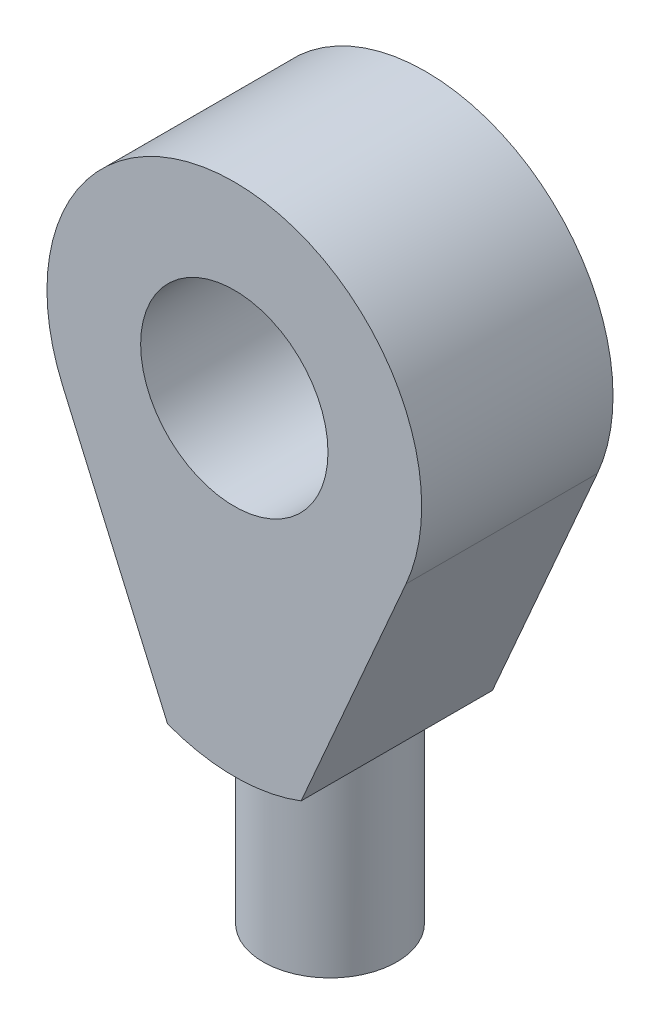
ISO-10303-21;
HEADER;
FILE_DESCRIPTION(('STEP AP214'),'2;1');
FILE_NAME('part.step','',(''),(''),'','','');
FILE_SCHEMA(('AUTOMOTIVE_DESIGN { 1 0 10303 214 1 1 1 1 }'));
ENDSEC;
DATA;
#1=APPLICATION_CONTEXT('core data for automotive mechanical design processes');
#2=APPLICATION_PROTOCOL_DEFINITION('international standard','automotive_design',2000,#1);
#3=PRODUCT_CONTEXT('',#1,'mechanical');
#4=PRODUCT('Part','Part','',(#3));
#5=PRODUCT_RELATED_PRODUCT_CATEGORY('part','',(#4));
#6=PRODUCT_DEFINITION_FORMATION('','',#4);
#7=PRODUCT_DEFINITION_CONTEXT('part definition',#1,'design');
#8=PRODUCT_DEFINITION('design','',#6,#7);
#9=PRODUCT_DEFINITION_SHAPE('','',#8);
#10=(LENGTH_UNIT() NAMED_UNIT(*) SI_UNIT(.MILLI.,.METRE.));
#11=(NAMED_UNIT(*) PLANE_ANGLE_UNIT() SI_UNIT($,.RADIAN.));
#12=(NAMED_UNIT(*) SI_UNIT($,.STERADIAN.) SOLID_ANGLE_UNIT());
#13=UNCERTAINTY_MEASURE_WITH_UNIT(LENGTH_MEASURE(1.E-05),#10,'distance_accuracy_value','');
#14=(GEOMETRIC_REPRESENTATION_CONTEXT(3) GLOBAL_UNCERTAINTY_ASSIGNED_CONTEXT((#13)) GLOBAL_UNIT_ASSIGNED_CONTEXT((#10,
#11,#12)) REPRESENTATION_CONTEXT('',''));
#15=CARTESIAN_POINT('',(0.,0.,0.));
#16=DIRECTION('',(0.,0.,1.));
#17=DIRECTION('',(1.,0.,0.));
#18=AXIS2_PLACEMENT_3D('',#15,#16,#17);
#19=CARTESIAN_POINT('',(0.,-3.74415824319179,2.5535));
#20=DIRECTION('',(0.,0.,-1.));
#21=DIRECTION('',(-1.,0.,0.));
#22=AXIS2_PLACEMENT_3D('',#19,#20,#21);
#23=CYLINDRICAL_SURFACE('',#22,5.);
#24=CARTESIAN_POINT('',(0.,-3.74415824319179,-2.5535));
#25=DIRECTION('',(0.,0.,1.));
#26=DIRECTION('',(1.,0.,0.));
#27=AXIS2_PLACEMENT_3D('',#24,#25,#26);
#28=CIRCLE('',#27,5.);
#29=CARTESIAN_POINT('',(-1.78257569495584,-8.41560597293818,-2.5535));
#30=VERTEX_POINT('',#29);
#31=CARTESIAN_POINT('',(1.78257569495584,-8.41560597293818,-2.5535));
#32=VERTEX_POINT('',#31);
#33=EDGE_CURVE('E122',#30,#32,#28,.T.);
#34=ORIENTED_EDGE('',*,*,#33,.T.);
#35=DIRECTION('',(0.,0.,-1.));
#36=VECTOR('',#35,1.);
#37=CARTESIAN_POINT('',(1.78257569495584,-8.41560597293818,2.5535));
#38=LINE('',#37,#36);
#39=CARTESIAN_POINT('',(1.78257569495584,-8.41560597293818,2.5535));
#40=VERTEX_POINT('',#39);
#41=EDGE_CURVE('E127',#40,#32,#38,.T.);
#42=ORIENTED_EDGE('',*,*,#41,.F.);
#43=CARTESIAN_POINT('',(0.,-3.74415824319179,2.5535));
#44=DIRECTION('',(0.,0.,1.));
#45=DIRECTION('',(1.,0.,0.));
#46=AXIS2_PLACEMENT_3D('',#43,#44,#45);
#47=CIRCLE('',#46,5.);
#48=CARTESIAN_POINT('',(-1.78257569495584,-8.41560597293818,2.5535));
#49=VERTEX_POINT('',#48);
#50=EDGE_CURVE('E113',#49,#40,#47,.T.);
#51=ORIENTED_EDGE('',*,*,#50,.F.);
#52=DIRECTION('',(0.,0.,-1.));
#53=VECTOR('',#52,1.);
#54=CARTESIAN_POINT('',(-1.78257569495584,-8.41560597293818,2.5535));
#55=LINE('',#54,#53);
#56=EDGE_CURVE('E130',#49,#30,#55,.T.);
#57=ORIENTED_EDGE('',*,*,#56,.T.);
#58=EDGE_LOOP('',(#34,#42,#51,#57));
#59=FACE_BOUND('',#58,.T.);
#60=CARTESIAN_POINT('',(-1.783,-8.41544404048572,0.));
#61=CARTESIAN_POINT('',(-1.78300204870079,-8.41544225055215,-0.0966687486173899));
#62=CARTESIAN_POINT('',(-1.77511201083355,-8.41847746815851,-0.193323323859854));
#63=CARTESIAN_POINT('',(-1.74388680267533,-8.43021547166098,-0.383741101134699));
#64=CARTESIAN_POINT('',(-1.72055083050801,-8.43891855180405,-0.477504152789002));
#65=CARTESIAN_POINT('',(-1.65938026698545,-8.46088378060267,-0.659343152631));
#66=CARTESIAN_POINT('',(-1.62157747900081,-8.47413592221476,-0.747431084003399));
#67=CARTESIAN_POINT('',(-1.53265736315804,-8.50369069688011,-0.916046767820779));
#68=CARTESIAN_POINT('',(-1.48153648026692,-8.51999414409842,-0.996572493847117));
#69=CARTESIAN_POINT('',(-1.3649747414681,-8.55463441080823,-1.15139044804879));
#70=CARTESIAN_POINT('',(-1.29903507005201,-8.57302702884546,-1.22529473390491));
#71=CARTESIAN_POINT('',(-1.15576870679623,-8.60930505557363,-1.36126561102769));
#72=CARTESIAN_POINT('',(-1.07843987800558,-8.62719036832604,-1.42332997573948));
#73=CARTESIAN_POINT('',(-0.911694731051714,-8.66109397488177,-1.53567812787832));
#74=CARTESIAN_POINT('',(-0.821982762232325,-8.67703912024034,-1.58554715400512));
#75=CARTESIAN_POINT('',(-0.634775199582545,-8.70460118849284,-1.66932799662043));
#76=CARTESIAN_POINT('',(-0.537282039658718,-8.71621945841272,-1.70324478016467));
#77=CARTESIAN_POINT('',(-0.341353195102965,-8.73342303574056,-1.75281838553072));
#78=CARTESIAN_POINT('',(-0.243105759314597,-8.73922786895913,-1.76914158096374));
#79=CARTESIAN_POINT('',(-0.0451061787319452,-8.74493444883303,-1.78519237670634));
#80=CARTESIAN_POINT('',(0.0546455146391507,-8.74483793255799,-1.78492486051237));
#81=CARTESIAN_POINT('',(0.248073012244122,-8.73889650426226,-1.76820569097229));
#82=CARTESIAN_POINT('',(0.341820796243922,-8.7333093431034,-1.75247970558897));
#83=CARTESIAN_POINT('',(0.525247089695727,-8.71734588891399,-1.70650125439661));
#84=CARTESIAN_POINT('',(0.614925314682114,-8.70696926166034,-1.6762477748101));
#85=CARTESIAN_POINT('',(0.789151533003908,-8.68228505454704,-1.60169762207798));
#86=CARTESIAN_POINT('',(0.87361008727431,-8.66792445664348,-1.55721020674817));
#87=CARTESIAN_POINT('',(1.03406423420748,-8.63674464615833,-1.45561814662698));
#88=CARTESIAN_POINT('',(1.11005724226286,-8.61992468631633,-1.39850966430311));
#89=CARTESIAN_POINT('',(1.25571973326146,-8.58451833881931,-1.26972583414325));
#90=CARTESIAN_POINT('',(1.32483519350775,-8.56588558632339,-1.19743567053106));
#91=CARTESIAN_POINT('',(1.450157692189,-8.52968932735765,-1.04215591838284));
#92=CARTESIAN_POINT('',(1.50636209737187,-8.51212603954452,-0.959164152599294));
#93=CARTESIAN_POINT('',(1.60518878066983,-8.47978200040321,-0.782849143368011));
#94=CARTESIAN_POINT('',(1.64754248432262,-8.46505831395548,-0.689364068317313));
#95=CARTESIAN_POINT('',(1.71570592982649,-8.44071855666418,-0.495927505957326));
#96=CARTESIAN_POINT('',(1.74152382669026,-8.4310999685258,-0.395979232940781));
#97=CARTESIAN_POINT('',(1.77468313324715,-8.41864211637545,-0.197882528329989));
#98=CARTESIAN_POINT('',(1.7828954209587,-8.41548368769826,-0.0999000156998455));
#99=CARTESIAN_POINT('',(1.7831025254825,-8.41540517704462,0.0960727421435664));
#100=CARTESIAN_POINT('',(1.77510086247396,-8.41848374096684,0.194062981060704));
#101=CARTESIAN_POINT('',(1.74389389853365,-8.43021080278229,0.383039725329369));
#102=CARTESIAN_POINT('',(1.72132989635962,-8.43862410672144,0.474148361737713));
#103=CARTESIAN_POINT('',(1.66242849501912,-8.459802854939,0.65125607686395));
#104=CARTESIAN_POINT('',(1.62608844113871,-8.4725691380105,0.737254167056843));
#105=CARTESIAN_POINT('',(1.53922795748122,-8.50156697538552,0.905042633000936));
#106=CARTESIAN_POINT('',(1.48825559142217,-8.51790420635593,0.986580268291881));
#107=CARTESIAN_POINT('',(1.37407212434439,-8.55201340113323,1.14025683204996));
#108=CARTESIAN_POINT('',(1.31085692786953,-8.5697858438822,1.21239260187003));
#109=CARTESIAN_POINT('',(1.16976279914558,-8.60597305868322,1.34942518154892));
#110=CARTESIAN_POINT('',(1.09125854619827,-8.62436763823166,1.41368553550655));
#111=CARTESIAN_POINT('',(0.924126786759345,-8.65875471454538,1.52818087204121));
#112=CARTESIAN_POINT('',(0.835499454810853,-8.67474725271589,1.5784160963895));
#113=CARTESIAN_POINT('',(0.650894808568895,-8.70248385721787,1.66303240966221));
#114=CARTESIAN_POINT('',(0.554957877391604,-8.71424946799413,1.69749414918203));
#115=CARTESIAN_POINT('',(0.358139690644887,-8.73229240491628,1.74962186855739));
#116=CARTESIAN_POINT('',(0.257260528810496,-8.73857203427941,1.76729489720533));
#117=CARTESIAN_POINT('',(0.0592037744732334,-8.7447371399863,1.78463914369696));
#118=CARTESIAN_POINT('',(-0.0378850271135194,-8.74494517695898,1.7852185022391));
#119=CARTESIAN_POINT('',(-0.230713503791566,-8.73976340006858,1.77065140956231));
#120=CARTESIAN_POINT('',(-0.326453315209246,-8.73437415602862,1.75550655912384));
#121=CARTESIAN_POINT('',(-0.511904668113668,-8.71873831846491,1.71054530369689));
#122=CARTESIAN_POINT('',(-0.601699204781967,-8.70859272741138,1.68103350659865));
#123=CARTESIAN_POINT('',(-0.775083158908863,-8.68449383843793,1.60846893675357));
#124=CARTESIAN_POINT('',(-0.858671410628845,-8.67053982746502,1.56541362801559));
#125=CARTESIAN_POINT('',(-1.02092284662026,-8.6395451495233,1.46501463671802));
#126=CARTESIAN_POINT('',(-1.09925548468536,-8.62240337628495,1.40716849235093));
#127=CARTESIAN_POINT('',(-1.24539055318258,-8.5871596846988,1.27964950689617));
#128=CARTESIAN_POINT('',(-1.31318937481222,-8.56905744013784,1.209972629727));
#129=CARTESIAN_POINT('',(-1.43956111373821,-8.53291466009824,1.05690644296318));
#130=CARTESIAN_POINT('',(-1.49755818711317,-8.51491616279492,0.973030051713991));
#131=CARTESIAN_POINT('',(-1.59862550917045,-8.48200939733302,0.796151261597241));
#132=CARTESIAN_POINT('',(-1.64169683697424,-8.4671009058004,0.703149523110305));
#133=CARTESIAN_POINT('',(-1.71152137108012,-8.44225202781046,0.510227460379807));
#134=CARTESIAN_POINT('',(-1.73822576887612,-8.43232651707402,0.410287422217113));
#135=CARTESIAN_POINT('',(-1.77395958900116,-8.4189250859456,0.20689166291151));
#136=CARTESIAN_POINT('',(-1.78299780784445,-8.41544595575456,0.103437717568953));
#137=CARTESIAN_POINT('',(-1.783,-8.41544404048572,0.));
#138=B_SPLINE_CURVE_WITH_KNOTS('',3,(#60,#61,#62,#63,#64,#65,#66,#67,#68,#69,#70,#71,#72,#73,
#74,#75,#76,#77,#78,#79,#80,#81,#82,#83,#84,#85,#86,#87,#88,#89,#90,#91,#92,#93,#94,#95,#96,#97,
#98,#99,#100,#101,#102,#103,#104,#105,#106,#107,#108,#109,#110,#111,#112,#113,#114,#115,#116,
#117,#118,#119,#120,#121,#122,#123,#124,#125,#126,#127,#128,#129,#130,#131,#132,#133,#134,#135,
#136,#137),.UNSPECIFIED.,.T.,.F.,(4,2,2,2,2,2,2,2,2,2,2,2,2,2,2,2,2,2,2,2,2,2,2,2,2,2,2,2,2,2,2,
2,2,2,2,2,2,2,4),(0.,0.289622030932842,0.579259098785138,0.86826306214391,1.15734424925065,
1.45821022209248,1.75913271859222,2.06918921728851,2.37914910955957,2.67690489015414,
2.97457302638311,3.2589041296081,3.54325507729918,3.83158838536796,4.12000948431055,
4.42382523474641,4.72770289449628,5.037164810908,5.34647399131535,5.64009174083536,
5.93364575040874,6.21508078753277,6.49657008618544,6.78791488956468,7.07935732210617,
7.38721279029953,7.69506295121932,8.00132097578376,8.30745036006169,8.59728486366296,
8.88708986397296,9.17100169386401,9.45496671726406,9.75028550655448,10.0457052476971,
10.3548665975626,10.6640055906025,10.9740620504472,11.2839640846191),.UNSPECIFIED.);
#139=CARTESIAN_POINT('',(-1.78154275821355,-8.416,-0.0720721905929052));
#140=VERTEX_POINT('',#139);
#141=CARTESIAN_POINT('',(1.78154275821355,-8.416,-0.0720721905927877));
#142=VERTEX_POINT('',#141);
#143=EDGE_CURVE('E11',#140,#142,#138,.T.);
#144=ORIENTED_EDGE('',*,*,#143,.F.);
#145=DIRECTION('',(0.,0.,-1.));
#146=VECTOR('',#145,1.);
#147=CARTESIAN_POINT('',(-1.78154275821355,-8.416,2.5535));
#148=LINE('',#147,#146);
#149=CARTESIAN_POINT('',(-1.78154275821355,-8.416,0.0720721905928935));
#150=VERTEX_POINT('',#149);
#151=EDGE_CURVE('E37',#150,#140,#148,.T.);
#152=ORIENTED_EDGE('',*,*,#151,.F.);
#153=CARTESIAN_POINT('',(1.78154275821355,-8.416,0.0720721905927759));
#154=VERTEX_POINT('',#153);
#155=EDGE_CURVE('E43',#154,#150,#138,.T.);
#156=ORIENTED_EDGE('',*,*,#155,.F.);
#157=DIRECTION('',(0.,0.,-1.));
#158=VECTOR('',#157,1.);
#159=CARTESIAN_POINT('',(1.78154275821355,-8.416,2.5535));
#160=LINE('',#159,#158);
#161=EDGE_CURVE('E53',#142,#154,#160,.F.);
#162=ORIENTED_EDGE('',*,*,#161,.F.);
#163=EDGE_LOOP('',(#144,#152,#156,#162));
#164=FACE_BOUND('',#163,.T.);
#165=ADVANCED_FACE('F33',(#59,#164),#23,.T.);
#166=CARTESIAN_POINT('',(0.,0.,2.5535));
#167=DIRECTION('',(0.,0.,1.));
#168=DIRECTION('',(1.,0.,0.));
#169=AXIS2_PLACEMENT_3D('',#166,#167,#168);
#170=PLANE('',#169);
#171=CARTESIAN_POINT('',(0.,0.,2.5535));
#172=DIRECTION('',(0.,0.,1.));
#173=DIRECTION('',(1.,0.,0.));
#174=AXIS2_PLACEMENT_3D('',#171,#172,#173);
#175=CIRCLE('',#174,5.);
#176=CARTESIAN_POINT('',(4.58257569495584,-2.,2.5535));
#177=VERTEX_POINT('',#176);
#178=CARTESIAN_POINT('',(-4.58257569495584,-2.,2.5535));
#179=VERTEX_POINT('',#178);
#180=EDGE_CURVE('E107',#177,#179,#175,.T.);
#181=ORIENTED_EDGE('',*,*,#180,.T.);
#182=DIRECTION('',(0.4,-0.916515138991168,0.));
#183=VECTOR('',#182,1.);
#184=CARTESIAN_POINT('',(-4.58257569495584,-2.,2.5535));
#185=LINE('',#184,#183);
#186=EDGE_CURVE('E110',#179,#49,#185,.T.);
#187=ORIENTED_EDGE('',*,*,#186,.T.);
#188=ORIENTED_EDGE('',*,*,#50,.T.);
#189=DIRECTION('',(0.4,0.916515138991168,0.));
#190=VECTOR('',#189,1.);
#191=CARTESIAN_POINT('',(4.58257569495584,-2.,2.5535));
#192=LINE('',#191,#190);
#193=EDGE_CURVE('E115',#40,#177,#192,.T.);
#194=ORIENTED_EDGE('',*,*,#193,.T.);
#195=EDGE_LOOP('',(#181,#187,#188,#194));
#196=FACE_BOUND('',#195,.T.);
#197=CARTESIAN_POINT('',(0.,0.,2.5535));
#198=DIRECTION('',(0.,0.,1.));
#199=DIRECTION('',(1.,0.,0.));
#200=AXIS2_PLACEMENT_3D('',#197,#198,#199);
#201=CIRCLE('',#200,2.5);
#202=CARTESIAN_POINT('',(-2.5,0.,2.5535));
#203=VERTEX_POINT('',#202);
#204=EDGE_CURVE('E101',#203,#203,#201,.T.);
#205=ORIENTED_EDGE('',*,*,#204,.F.);
#206=EDGE_LOOP('',(#205));
#207=FACE_BOUND('',#206,.T.);
#208=ADVANCED_FACE('F169',(#196,#207),#170,.T.);
#209=CARTESIAN_POINT('',(0.,0.,-2.5535));
#210=DIRECTION('',(0.,0.,1.));
#211=DIRECTION('',(1.,0.,0.));
#212=AXIS2_PLACEMENT_3D('',#209,#210,#211);
#213=PLANE('',#212);
#214=CARTESIAN_POINT('',(0.,0.,-2.5535));
#215=DIRECTION('',(0.,0.,1.));
#216=DIRECTION('',(1.,0.,0.));
#217=AXIS2_PLACEMENT_3D('',#214,#215,#216);
#218=CIRCLE('',#217,5.);
#219=CARTESIAN_POINT('',(4.58257569495584,-2.,-2.5535));
#220=VERTEX_POINT('',#219);
#221=CARTESIAN_POINT('',(-4.58257569495584,-2.,-2.5535));
#222=VERTEX_POINT('',#221);
#223=EDGE_CURVE('E104',#220,#222,#218,.T.);
#224=ORIENTED_EDGE('',*,*,#223,.F.);
#225=DIRECTION('',(0.4,0.916515138991168,0.));
#226=VECTOR('',#225,1.);
#227=CARTESIAN_POINT('',(4.58257569495584,-2.,-2.5535));
#228=LINE('',#227,#226);
#229=EDGE_CURVE('E111',#32,#220,#228,.T.);
#230=ORIENTED_EDGE('',*,*,#229,.F.);
#231=ORIENTED_EDGE('',*,*,#33,.F.);
#232=DIRECTION('',(0.4,-0.916515138991168,0.));
#233=VECTOR('',#232,1.);
#234=CARTESIAN_POINT('',(-4.58257569495584,-2.,-2.5535));
#235=LINE('',#234,#233);
#236=EDGE_CURVE('E120',#222,#30,#235,.T.);
#237=ORIENTED_EDGE('',*,*,#236,.F.);
#238=EDGE_LOOP('',(#224,#230,#231,#237));
#239=FACE_BOUND('',#238,.T.);
#240=CARTESIAN_POINT('',(0.,0.,-2.5535));
#241=DIRECTION('',(0.,0.,1.));
#242=DIRECTION('',(1.,0.,0.));
#243=AXIS2_PLACEMENT_3D('',#240,#241,#242);
#244=CIRCLE('',#243,2.5);
#245=CARTESIAN_POINT('',(-2.5,0.,-2.5535));
#246=VERTEX_POINT('',#245);
#247=EDGE_CURVE('E95',#246,#246,#244,.T.);
#248=ORIENTED_EDGE('',*,*,#247,.T.);
#249=EDGE_LOOP('',(#248));
#250=FACE_BOUND('',#249,.T.);
#251=ADVANCED_FACE('F172',(#239,#250),#213,.F.);
#252=CARTESIAN_POINT('',(0.,0.,2.5535));
#253=DIRECTION('',(0.,0.,-1.));
#254=DIRECTION('',(-1.,0.,0.));
#255=AXIS2_PLACEMENT_3D('',#252,#253,#254);
#256=CYLINDRICAL_SURFACE('',#255,5.);
#257=ORIENTED_EDGE('',*,*,#223,.T.);
#258=DIRECTION('',(0.,0.,-1.));
#259=VECTOR('',#258,1.);
#260=CARTESIAN_POINT('',(-4.58257569495584,-2.,2.5535));
#261=LINE('',#260,#259);
#262=EDGE_CURVE('E133',#179,#222,#261,.T.);
#263=ORIENTED_EDGE('',*,*,#262,.F.);
#264=ORIENTED_EDGE('',*,*,#180,.F.);
#265=DIRECTION('',(0.,0.,-1.));
#266=VECTOR('',#265,1.);
#267=CARTESIAN_POINT('',(4.58257569495584,-2.,2.5535));
#268=LINE('',#267,#266);
#269=EDGE_CURVE('E117',#177,#220,#268,.T.);
#270=ORIENTED_EDGE('',*,*,#269,.T.);
#271=EDGE_LOOP('',(#257,#263,#264,#270));
#272=FACE_BOUND('',#271,.T.);
#273=ADVANCED_FACE('F35',(#272),#256,.T.);
#274=CARTESIAN_POINT('',(-4.58257569495584,-2.,2.5535));
#275=DIRECTION('',(0.916515138991168,0.4,0.));
#276=DIRECTION('',(-0.4,0.916515138991168,0.));
#277=AXIS2_PLACEMENT_3D('',#274,#275,#276);
#278=PLANE('',#277);
#279=ORIENTED_EDGE('',*,*,#236,.T.);
#280=ORIENTED_EDGE('',*,*,#56,.F.);
#281=ORIENTED_EDGE('',*,*,#186,.F.);
#282=ORIENTED_EDGE('',*,*,#262,.T.);
#283=EDGE_LOOP('',(#279,#280,#281,#282));
#284=FACE_BOUND('',#283,.T.);
#285=ADVANCED_FACE('F177',(#284),#278,.F.);
#286=CARTESIAN_POINT('',(4.58257569495584,-2.,2.5535));
#287=DIRECTION('',(-0.916515138991168,0.4,0.));
#288=DIRECTION('',(-0.4,-0.916515138991168,0.));
#289=AXIS2_PLACEMENT_3D('',#286,#287,#288);
#290=PLANE('',#289);
#291=ORIENTED_EDGE('',*,*,#229,.T.);
#292=ORIENTED_EDGE('',*,*,#269,.F.);
#293=ORIENTED_EDGE('',*,*,#193,.F.);
#294=ORIENTED_EDGE('',*,*,#41,.T.);
#295=EDGE_LOOP('',(#291,#292,#293,#294));
#296=FACE_BOUND('',#295,.T.);
#297=ADVANCED_FACE('F167',(#296),#290,.F.);
#298=CARTESIAN_POINT('',(0.,0.,2.5535));
#299=DIRECTION('',(0.,0.,-1.));
#300=DIRECTION('',(-1.,0.,0.));
#301=AXIS2_PLACEMENT_3D('',#298,#299,#300);
#302=CYLINDRICAL_SURFACE('',#301,2.5);
#303=CARTESIAN_POINT('',(-2.5,0.,2.5535));
#304=CARTESIAN_POINT('',(-2.5,0.,2.50030208333333));
#305=CARTESIAN_POINT('',(-2.5,0.,2.44710416666667));
#306=CARTESIAN_POINT('',(-2.5,0.,2.34070833333333));
#307=CARTESIAN_POINT('',(-2.5,0.,2.28751041666667));
#308=CARTESIAN_POINT('',(-2.5,0.,2.18111458333333));
#309=CARTESIAN_POINT('',(-2.5,0.,2.12791666666667));
#310=CARTESIAN_POINT('',(-2.5,0.,2.02152083333333));
#311=CARTESIAN_POINT('',(-2.5,0.,1.96832291666667));
#312=CARTESIAN_POINT('',(-2.5,0.,1.86192708333333));
#313=CARTESIAN_POINT('',(-2.5,0.,1.80872916666667));
#314=CARTESIAN_POINT('',(-2.5,0.,1.70233333333333));
#315=CARTESIAN_POINT('',(-2.5,0.,1.64913541666667));
#316=CARTESIAN_POINT('',(-2.5,0.,1.54273958333333));
#317=CARTESIAN_POINT('',(-2.5,0.,1.48954166666667));
#318=CARTESIAN_POINT('',(-2.5,0.,1.38314583333333));
#319=CARTESIAN_POINT('',(-2.5,0.,1.32994791666667));
#320=CARTESIAN_POINT('',(-2.5,0.,1.22355208333333));
#321=CARTESIAN_POINT('',(-2.5,0.,1.17035416666667));
#322=CARTESIAN_POINT('',(-2.5,0.,1.06395833333333));
#323=CARTESIAN_POINT('',(-2.5,0.,1.01076041666667));
#324=CARTESIAN_POINT('',(-2.5,0.,0.904364583333333));
#325=CARTESIAN_POINT('',(-2.5,0.,0.851166666666666));
#326=CARTESIAN_POINT('',(-2.5,0.,0.744770833333333));
#327=CARTESIAN_POINT('',(-2.5,0.,0.691572916666666));
#328=CARTESIAN_POINT('',(-2.5,0.,0.585177083333333));
#329=CARTESIAN_POINT('',(-2.5,0.,0.531979166666666));
#330=CARTESIAN_POINT('',(-2.5,0.,0.425583333333333));
#331=CARTESIAN_POINT('',(-2.5,0.,0.372385416666666));
#332=CARTESIAN_POINT('',(-2.5,0.,0.265989583333333));
#333=CARTESIAN_POINT('',(-2.5,0.,0.212791666666666));
#334=CARTESIAN_POINT('',(-2.5,0.,0.106395833333333));
#335=CARTESIAN_POINT('',(-2.5,0.,0.0531979166666662));
#336=CARTESIAN_POINT('',(-2.5,0.,-0.0531979166666671));
#337=CARTESIAN_POINT('',(-2.5,0.,-0.106395833333334));
#338=CARTESIAN_POINT('',(-2.5,0.,-0.212791666666667));
#339=CARTESIAN_POINT('',(-2.5,0.,-0.265989583333334));
#340=CARTESIAN_POINT('',(-2.5,0.,-0.372385416666667));
#341=CARTESIAN_POINT('',(-2.5,0.,-0.425583333333334));
#342=CARTESIAN_POINT('',(-2.5,0.,-0.531979166666667));
#343=CARTESIAN_POINT('',(-2.5,0.,-0.585177083333334));
#344=CARTESIAN_POINT('',(-2.5,0.,-0.691572916666667));
#345=CARTESIAN_POINT('',(-2.5,0.,-0.744770833333334));
#346=CARTESIAN_POINT('',(-2.5,0.,-0.851166666666668));
#347=CARTESIAN_POINT('',(-2.5,0.,-0.904364583333334));
#348=CARTESIAN_POINT('',(-2.5,0.,-1.01076041666667));
#349=CARTESIAN_POINT('',(-2.5,0.,-1.06395833333333));
#350=CARTESIAN_POINT('',(-2.5,0.,-1.17035416666667));
#351=CARTESIAN_POINT('',(-2.5,0.,-1.22355208333333));
#352=CARTESIAN_POINT('',(-2.5,0.,-1.32994791666667));
#353=CARTESIAN_POINT('',(-2.5,0.,-1.38314583333333));
#354=CARTESIAN_POINT('',(-2.5,0.,-1.48954166666667));
#355=CARTESIAN_POINT('',(-2.5,0.,-1.54273958333333));
#356=CARTESIAN_POINT('',(-2.5,0.,-1.64913541666667));
#357=CARTESIAN_POINT('',(-2.5,0.,-1.70233333333333));
#358=CARTESIAN_POINT('',(-2.5,0.,-1.80872916666667));
#359=CARTESIAN_POINT('',(-2.5,0.,-1.86192708333333));
#360=CARTESIAN_POINT('',(-2.5,0.,-1.96832291666667));
#361=CARTESIAN_POINT('',(-2.5,0.,-2.02152083333333));
#362=CARTESIAN_POINT('',(-2.5,0.,-2.12791666666667));
#363=CARTESIAN_POINT('',(-2.5,0.,-2.18111458333333));
#364=CARTESIAN_POINT('',(-2.5,0.,-2.28751041666667));
#365=CARTESIAN_POINT('',(-2.5,0.,-2.34070833333333));
#366=CARTESIAN_POINT('',(-2.5,0.,-2.44710416666667));
#367=CARTESIAN_POINT('',(-2.5,0.,-2.50030208333333));
#368=CARTESIAN_POINT('',(-2.5,0.,-2.5535));
#369=B_SPLINE_CURVE_WITH_KNOTS('',3,(#303,#304,#305,#306,#307,#308,#309,#310,#311,#312,#313,
#314,#315,#316,#317,#318,#319,#320,#321,#322,#323,#324,#325,#326,#327,#328,#329,#330,#331,#332,
#333,#334,#335,#336,#337,#338,#339,#340,#341,#342,#343,#344,#345,#346,#347,#348,#349,#350,#351,
#352,#353,#354,#355,#356,#357,#358,#359,#360,#361,#362,#363,#364,#365,#366,#367,#368),
.UNSPECIFIED.,.F.,.F.,(4,2,2,2,2,2,2,2,2,2,2,2,2,2,2,2,2,2,2,2,2,2,2,2,2,2,2,2,2,2,2,2,4),(0.,
0.15959375,0.3191875,0.47878125,0.638375,0.79796875,0.957562500000001,1.11715625,1.27675,
1.43634375,1.5959375,1.75553125,1.915125,2.07471875,2.2343125,2.39390625,2.5535,2.71309375,
2.8726875,3.03228125,3.191875,3.35146875,3.5110625,3.67065625,3.83025,3.98984375,4.1494375,
4.30903125,4.468625,4.62821875,4.7878125,4.94740625,5.107),.UNSPECIFIED.);
#370=EDGE_CURVE('BSEAM164',#203,#246,#369,.T.);
#371=ORIENTED_EDGE('',*,*,#204,.T.);
#372=ORIENTED_EDGE('',*,*,#247,.F.);
#373=ORIENTED_EDGE('',*,*,#370,.T.);
#374=ORIENTED_EDGE('',*,*,#370,.F.);
#375=EDGE_LOOP('',(#371,#373,#372,#374));
#376=FACE_BOUND('',#375,.T.);
#377=ADVANCED_FACE('F164',(#376),#302,.F.);
#378=CARTESIAN_POINT('',(1.,-8.416,0.));
#379=DIRECTION('',(0.,-1.,0.));
#380=DIRECTION('',(1.,0.,0.));
#381=AXIS2_PLACEMENT_3D('',#378,#379,#380);
#382=PLANE('',#381);
#383=CARTESIAN_POINT('',(0.,-8.416,0.));
#384=DIRECTION('',(0.,1.,0.));
#385=DIRECTION('',(-1.,0.,0.));
#386=AXIS2_PLACEMENT_3D('',#383,#384,#385);
#387=CIRCLE('',#386,1.783);
#388=EDGE_CURVE('E88',#140,#150,#387,.T.);
#389=ORIENTED_EDGE('',*,*,#388,.T.);
#390=ORIENTED_EDGE('',*,*,#151,.T.);
#391=EDGE_LOOP('',(#389,#390));
#392=FACE_BOUND('',#391,.T.);
#393=ADVANCED_FACE('F92',(#392),#382,.F.);
#394=EDGE_CURVE('E90',#154,#142,#387,.T.);
#395=ORIENTED_EDGE('',*,*,#394,.T.);
#396=ORIENTED_EDGE('',*,*,#161,.T.);
#397=EDGE_LOOP('',(#395,#396));
#398=FACE_BOUND('',#397,.T.);
#399=ADVANCED_FACE('F160',(#398),#382,.F.);
#400=CARTESIAN_POINT('',(0.,-8.74415824319179,0.));
#401=DIRECTION('',(0.,1.,0.));
#402=DIRECTION('',(-1.,0.,0.));
#403=AXIS2_PLACEMENT_3D('',#400,#401,#402);
#404=CYLINDRICAL_SURFACE('',#403,1.783);
#405=CARTESIAN_POINT('',(0.,-13.416,0.));
#406=DIRECTION('',(0.,1.,0.));
#407=DIRECTION('',(-1.,0.,0.));
#408=AXIS2_PLACEMENT_3D('',#405,#406,#407);
#409=CIRCLE('',#408,1.783);
#410=CARTESIAN_POINT('',(-1.783,-13.416,0.));
#411=VERTEX_POINT('',#410);
#412=EDGE_CURVE('E93',#411,#411,#409,.T.);
#413=ORIENTED_EDGE('',*,*,#412,.T.);
#414=EDGE_LOOP('',(#413));
#415=FACE_BOUND('',#414,.T.);
#416=ORIENTED_EDGE('',*,*,#388,.F.);
#417=ORIENTED_EDGE('',*,*,#143,.T.);
#418=ORIENTED_EDGE('',*,*,#394,.F.);
#419=ORIENTED_EDGE('',*,*,#155,.T.);
#420=EDGE_LOOP('',(#416,#417,#418,#419));
#421=FACE_BOUND('',#420,.T.);
#422=ADVANCED_FACE('F87',(#415,#421),#404,.T.);
#423=CARTESIAN_POINT('',(0.,-8.74415824319179,0.));
#424=DIRECTION('',(0.,1.,0.));
#425=DIRECTION('',(-1.,0.,0.));
#426=AXIS2_PLACEMENT_3D('',#423,#424,#425);
#427=CYLINDRICAL_SURFACE('',#426,1.);
#428=CARTESIAN_POINT('',(0.,-13.416,0.));
#429=DIRECTION('',(0.,1.,0.));
#430=DIRECTION('',(-1.,0.,0.));
#431=AXIS2_PLACEMENT_3D('',#428,#429,#430);
#432=CIRCLE('',#431,1.);
#433=CARTESIAN_POINT('',(-1.,-13.416,0.));
#434=VERTEX_POINT('',#433);
#435=EDGE_CURVE('E97',#434,#434,#432,.T.);
#436=ORIENTED_EDGE('',*,*,#435,.F.);
#437=EDGE_LOOP('',(#436));
#438=FACE_BOUND('',#437,.T.);
#439=CARTESIAN_POINT('',(-1.,-8.64313772875814,0.));
#440=CARTESIAN_POINT('',(-0.999997945876047,-8.64313883363111,0.0555643754819783));
#441=CARTESIAN_POINT('',(-0.995353171723657,-8.64409332666092,0.111154623306494));
#442=CARTESIAN_POINT('',(-0.976912283588336,-8.64780255704441,0.220762505118408));
#443=CARTESIAN_POINT('',(-0.963108847071183,-8.65055873485511,0.27477884463107));
#444=CARTESIAN_POINT('',(-0.926795782617739,-8.65754698019535,0.37963730336293));
#445=CARTESIAN_POINT('',(-0.904294814152084,-8.66177757934491,0.430482521534927));
#446=CARTESIAN_POINT('',(-0.851249107671044,-8.67123623805599,0.527674844694619));
#447=CARTESIAN_POINT('',(-0.820704818601297,-8.67646424194193,0.574022200537272));
#448=CARTESIAN_POINT('',(-0.751979075653291,-8.68741124011859,0.661561003854499));
#449=CARTESIAN_POINT('',(-0.71370565591328,-8.69313562156004,0.702679587884144));
#450=CARTESIAN_POINT('',(-0.630806789021351,-8.70438296622199,0.77795753357881));
#451=CARTESIAN_POINT('',(-0.586180896977996,-8.70990591530124,0.812116407417147));
#452=CARTESIAN_POINT('',(-0.491361355924246,-8.72018620736626,0.872788017628506));
#453=CARTESIAN_POINT('',(-0.441122567672209,-8.72493645760699,0.899231513816652));
#454=CARTESIAN_POINT('',(-0.336804150387276,-8.73307561202841,0.943274937048125));
#455=CARTESIAN_POINT('',(-0.282724881420555,-8.73646464363306,0.960875691900988));
#456=CARTESIAN_POINT('',(-0.173016773278495,-8.74146145007589,0.986507193619629));
#457=CARTESIAN_POINT('',(-0.117417739214815,-8.74309210607304,0.994660977571009));
#458=CARTESIAN_POINT('',(-0.00561856843753779,-8.74446745502784,1.00155095183832));
#459=CARTESIAN_POINT('',(0.0505815098318418,-8.74421232971938,1.00028804964582));
#460=CARTESIAN_POINT('',(0.161142000743587,-8.74186259187694,0.988473819784446));
#461=CARTESIAN_POINT('',(0.215517214298469,-8.73979422685017,0.978055022832152));
#462=CARTESIAN_POINT('',(0.3217316265803,-8.73408001478587,0.948434967541108));
#463=CARTESIAN_POINT('',(0.373570723747128,-8.73043410463218,0.929233357808127));
#464=CARTESIAN_POINT('',(0.473619463200886,-8.72193120339137,0.882469959852732));
#465=CARTESIAN_POINT('',(0.521804174133899,-8.71706672494402,0.854856248895113));
#466=CARTESIAN_POINT('',(0.612905045859755,-8.70666293792964,0.792090922763401));
#467=CARTESIAN_POINT('',(0.655820599525,-8.70112355174401,0.756938440229485));
#468=CARTESIAN_POINT('',(0.735951431053457,-8.68986788683638,0.679366377891528));
#469=CARTESIAN_POINT('',(0.773054316573631,-8.68415020776695,0.636830813270411));
#470=CARTESIAN_POINT('',(0.839618493176807,-8.67327395917939,0.546083557549248));
#471=CARTESIAN_POINT('',(0.86907963972775,-8.66811540023727,0.497871759116805));
#472=CARTESIAN_POINT('',(0.919562814801881,-8.65893871792102,0.396979168178195));
#473=CARTESIAN_POINT('',(0.940566647777709,-8.65492305882728,0.344289032360338));
#474=CARTESIAN_POINT('',(0.973390341627582,-8.64852300640451,0.236028676276009));
#475=CARTESIAN_POINT('',(0.985211399456642,-8.64613840047607,0.180458832380916));
#476=CARTESIAN_POINT('',(0.999166006036051,-8.64331303587006,0.0690351420009554));
#477=CARTESIAN_POINT('',(1.00146185889791,-8.64283971376333,0.0132024256896595));
#478=CARTESIAN_POINT('',(0.996737628310738,-8.64380310008033,-0.0980482231996835));
#479=CARTESIAN_POINT('',(0.989718073122442,-8.64523970019567,-0.153466179118863));
#480=CARTESIAN_POINT('',(0.966702208074157,-8.64983056814093,-0.261768640292235));
#481=CARTESIAN_POINT('',(0.950792620839298,-8.65296823333676,-0.314672343035763));
#482=CARTESIAN_POINT('',(0.910541035308517,-8.66059313670843,-0.417063279028742));
#483=CARTESIAN_POINT('',(0.886198342373176,-8.66508048605448,-0.466550230435721));
#484=CARTESIAN_POINT('',(0.829404142215598,-8.67497230281218,-0.561413109950161));
#485=CARTESIAN_POINT('',(0.796851077982754,-8.68038796184082,-0.606727046300827));
#486=CARTESIAN_POINT('',(0.724695572212712,-8.69149548145815,-0.691308312000916));
#487=CARTESIAN_POINT('',(0.685092405144537,-8.69718737042997,-0.730575018249255));
#488=CARTESIAN_POINT('',(0.59923227349789,-8.70831170188394,-0.802562559185577));
#489=CARTESIAN_POINT('',(0.552882498929629,-8.71373882027863,-0.835173654649997));
#490=CARTESIAN_POINT('',(0.455267896634754,-8.72362951947798,-0.892145881499584));
#491=CARTESIAN_POINT('',(0.404003275433506,-8.72809314074389,-0.916507359344783));
#492=CARTESIAN_POINT('',(0.298302680824012,-8.73553118380246,-0.956128871746635));
#493=CARTESIAN_POINT('',(0.243886673478077,-8.73851403461783,-0.971440518226252));
#494=CARTESIAN_POINT('',(0.133189454679912,-8.74269060256839,-0.992691247663846));
#495=CARTESIAN_POINT('',(0.0769084687112135,-8.74388453519022,-0.998631459475683));
#496=CARTESIAN_POINT('',(-0.0348728939036241,-8.74434364773299,-1.00092698096289));
#497=CARTESIAN_POINT('',(-0.0903698121415029,-8.7436420286853,-0.997447280456213));
#498=CARTESIAN_POINT('',(-0.199971031315642,-8.74045867879496,-0.981366049452189));
#499=CARTESIAN_POINT('',(-0.254075349753692,-8.7379769703353,-0.968764633651926));
#500=CARTESIAN_POINT('',(-0.359252749745097,-8.73151322684179,-0.934871007908357));
#501=CARTESIAN_POINT('',(-0.410332443240281,-8.72753461567091,-0.913598621868817));
#502=CARTESIAN_POINT('',(-0.508221220185953,-8.71850546442561,-0.862987758669101));
#503=CARTESIAN_POINT('',(-0.555029965767412,-8.71345483965056,-0.833648644096285));
#504=CARTESIAN_POINT('',(-0.643863890106359,-8.70273423477047,-0.76718061293792));
#505=CARTESIAN_POINT('',(-0.685799716116505,-8.69705557741321,-0.729933663613231));
#506=CARTESIAN_POINT('',(-0.762882617756848,-8.68577047222801,-0.648949759904225));
#507=CARTESIAN_POINT('',(-0.798028083202713,-8.68016404182054,-0.605211270531262));
#508=CARTESIAN_POINT('',(-0.860892219455202,-8.66959167069142,-0.511920683299822));
#509=CARTESIAN_POINT('',(-0.888526814639768,-8.66463327950506,-0.462311038839634));
#510=CARTESIAN_POINT('',(-0.93502404928781,-8.65601061503623,-0.359067226700307));
#511=CARTESIAN_POINT('',(-0.953894645979291,-8.65234516856135,-0.305436761302083));
#512=CARTESIAN_POINT('',(-0.978669139854274,-8.64745505448101,-0.209737544563433));
#513=CARTESIAN_POINT('',(-0.986653898522987,-8.64584609234839,-0.168214580488545));
#514=CARTESIAN_POINT('',(-0.997320017960411,-8.64368702777208,-0.0844660454463626));
#515=CARTESIAN_POINT('',(-1.00000156156206,-8.64313688882455,-0.0422404987518275));
#516=CARTESIAN_POINT('',(-1.,-8.64313772875814,0.));
#517=B_SPLINE_CURVE_WITH_KNOTS('',3,(#439,#440,#441,#442,#443,#444,#445,#446,#447,#448,#449,
#450,#451,#452,#453,#454,#455,#456,#457,#458,#459,#460,#461,#462,#463,#464,#465,#466,#467,#468,
#469,#470,#471,#472,#473,#474,#475,#476,#477,#478,#479,#480,#481,#482,#483,#484,#485,#486,#487,
#488,#489,#490,#491,#492,#493,#494,#495,#496,#497,#498,#499,#500,#501,#502,#503,#504,#505,#506,
#507,#508,#509,#510,#511,#512,#513,#514,#515,#516),.UNSPECIFIED.,.T.,.F.,(4,2,2,2,2,2,2,2,2,2,2,
2,2,2,2,2,2,2,2,2,2,2,2,2,2,2,2,2,2,2,2,2,2,2,2,2,2,2,4),(0.,0.166538463856524,
0.333210239259265,0.499716497915554,0.666213464834832,0.834822525459336,1.00344340032919,
1.17353400434947,1.34360868244057,1.51144248880577,1.67926012113745,1.84468789631034,
2.01012229071247,2.176599242198,2.34309535767563,2.5124934675998,2.68189478120217,
2.85165863170274,3.02140035013522,3.18823757802091,3.35506534525919,3.52029341780816,
3.68553510351895,3.85293059772018,4.02034332867706,4.19032601730948,4.36030156627602,
4.52929813576147,4.69827434689125,4.86431017412183,5.03034391364254,5.19600017072949,
5.36166952132181,5.53001152023094,5.69839338887278,5.86858898576538,6.0386297508643,
6.16523803634393,6.29184195681712),.UNSPECIFIED.);
#518=CARTESIAN_POINT('',(-1.,-8.64313772875814,0.));
#519=VERTEX_POINT('',#518);
#520=EDGE_CURVE('E91',#519,#519,#517,.T.);
#521=ORIENTED_EDGE('',*,*,#520,.T.);
#522=EDGE_LOOP('',(#521));
#523=FACE_BOUND('',#522,.T.);
#524=ADVANCED_FACE('F148',(#438,#523),#427,.F.);
#525=CARTESIAN_POINT('',(1.783,-13.416,0.));
#526=DIRECTION('',(0.,1.,0.));
#527=DIRECTION('',(-1.,0.,0.));
#528=AXIS2_PLACEMENT_3D('',#525,#526,#527);
#529=PLANE('',#528);
#530=ORIENTED_EDGE('',*,*,#412,.F.);
#531=EDGE_LOOP('',(#530));
#532=FACE_BOUND('',#531,.T.);
#533=ORIENTED_EDGE('',*,*,#435,.T.);
#534=EDGE_LOOP('',(#533));
#535=FACE_BOUND('',#534,.T.);
#536=ADVANCED_FACE('F152',(#532,#535),#529,.F.);
#537=ORIENTED_EDGE('',*,*,#520,.F.);
#538=EDGE_LOOP('',(#537));
#539=FACE_BOUND('',#538,.T.);
#540=ADVANCED_FACE('F155',(#539),#23,.T.);
#541=CLOSED_SHELL('',(#165,#208,#251,#273,#285,#297,#377,#393,#399,#422,#524,#536,#540));
#542=MANIFOLD_SOLID_BREP('B2',#541);
#543=ADVANCED_BREP_SHAPE_REPRESENTATION('',(#18,#542),#14);
#544=SHAPE_DEFINITION_REPRESENTATION(#9,#543);
ENDSEC;
END-ISO-10303-21;
